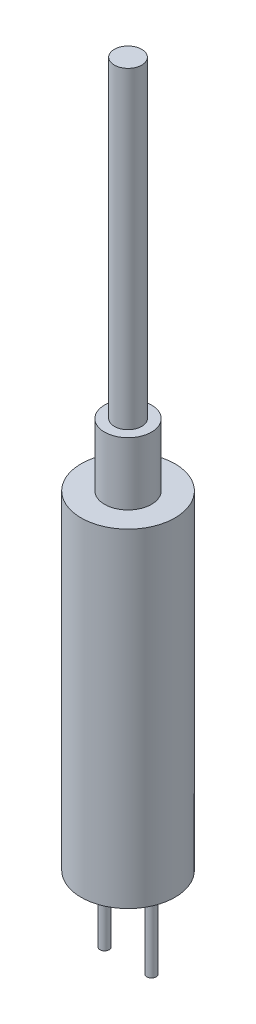
ISO-10303-21;
HEADER;
FILE_DESCRIPTION(('STEP AP214'),'2;1');
FILE_NAME('part.step','',(''),(''),'','','');
FILE_SCHEMA(('AUTOMOTIVE_DESIGN { 1 0 10303 214 1 1 1 1 }'));
ENDSEC;
DATA;
#1=APPLICATION_CONTEXT('core data for automotive mechanical design processes');
#2=APPLICATION_PROTOCOL_DEFINITION('international standard','automotive_design',2000,#1);
#3=PRODUCT_CONTEXT('',#1,'mechanical');
#4=PRODUCT('Part','Part','',(#3));
#5=PRODUCT_RELATED_PRODUCT_CATEGORY('part','',(#4));
#6=PRODUCT_DEFINITION_FORMATION('','',#4);
#7=PRODUCT_DEFINITION_CONTEXT('part definition',#1,'design');
#8=PRODUCT_DEFINITION('design','',#6,#7);
#9=PRODUCT_DEFINITION_SHAPE('','',#8);
#10=(LENGTH_UNIT() NAMED_UNIT(*) SI_UNIT(.MILLI.,.METRE.));
#11=(NAMED_UNIT(*) PLANE_ANGLE_UNIT() SI_UNIT($,.RADIAN.));
#12=(NAMED_UNIT(*) SI_UNIT($,.STERADIAN.) SOLID_ANGLE_UNIT());
#13=UNCERTAINTY_MEASURE_WITH_UNIT(LENGTH_MEASURE(1.E-05),#10,'distance_accuracy_value','');
#14=(GEOMETRIC_REPRESENTATION_CONTEXT(3) GLOBAL_UNCERTAINTY_ASSIGNED_CONTEXT((#13)) GLOBAL_UNIT_ASSIGNED_CONTEXT((#10,
#11,#12)) REPRESENTATION_CONTEXT('',''));
#15=CARTESIAN_POINT('',(0.,0.,0.));
#16=DIRECTION('',(0.,0.,1.));
#17=DIRECTION('',(1.,0.,0.));
#18=AXIS2_PLACEMENT_3D('',#15,#16,#17);
#19=CARTESIAN_POINT('',(0.,100.,0.));
#20=DIRECTION('',(0.,-1.,0.));
#21=DIRECTION('',(0.,0.,-1.));
#22=AXIS2_PLACEMENT_3D('',#19,#20,#21);
#23=CYLINDRICAL_SURFACE('',#22,1.75);
#24=CARTESIAN_POINT('',(0.,100.,0.));
#25=DIRECTION('',(0.,1.,0.));
#26=DIRECTION('',(0.,0.,1.));
#27=AXIS2_PLACEMENT_3D('',#24,#25,#26);
#28=CIRCLE('',#27,1.75);
#29=CARTESIAN_POINT('',(0.,100.,1.75));
#30=VERTEX_POINT('',#29);
#31=EDGE_CURVE('E11',#30,#30,#28,.T.);
#32=ORIENTED_EDGE('',*,*,#31,.F.);
#33=EDGE_LOOP('',(#32));
#34=FACE_BOUND('',#33,.T.);
#35=CARTESIAN_POINT('',(0.,60.,0.));
#36=DIRECTION('',(0.,1.,0.));
#37=DIRECTION('',(0.,0.,1.));
#38=AXIS2_PLACEMENT_3D('',#35,#36,#37);
#39=CIRCLE('',#38,1.75);
#40=CARTESIAN_POINT('',(0.,60.,1.75));
#41=VERTEX_POINT('',#40);
#42=EDGE_CURVE('E60',#41,#41,#39,.T.);
#43=ORIENTED_EDGE('',*,*,#42,.T.);
#44=EDGE_LOOP('',(#43));
#45=FACE_BOUND('',#44,.T.);
#46=ADVANCED_FACE('F53',(#34,#45),#23,.T.);
#47=CARTESIAN_POINT('',(0.,100.,0.));
#48=DIRECTION('',(0.,1.,0.));
#49=DIRECTION('',(0.,0.,1.));
#50=AXIS2_PLACEMENT_3D('',#47,#48,#49);
#51=PLANE('',#50);
#52=ORIENTED_EDGE('',*,*,#31,.T.);
#53=EDGE_LOOP('',(#52));
#54=FACE_BOUND('',#53,.T.);
#55=ADVANCED_FACE('F66',(#54),#51,.T.);
#56=CARTESIAN_POINT('',(0.,60.,0.));
#57=DIRECTION('',(0.,1.,0.));
#58=DIRECTION('',(0.,0.,1.));
#59=AXIS2_PLACEMENT_3D('',#56,#57,#58);
#60=PLANE('',#59);
#61=ORIENTED_EDGE('',*,*,#42,.F.);
#62=EDGE_LOOP('',(#61));
#63=FACE_BOUND('',#62,.T.);
#64=ADVANCED_FACE('F70',(#63),#60,.F.);
#65=CLOSED_SHELL('',(#46,#55,#64));
#66=MANIFOLD_SOLID_BREP('B2',#65);
#67=CARTESIAN_POINT('',(0.,60.,0.));
#68=DIRECTION('',(0.,-1.,0.));
#69=DIRECTION('',(0.,0.,-1.));
#70=AXIS2_PLACEMENT_3D('',#67,#68,#69);
#71=CYLINDRICAL_SURFACE('',#70,3.);
#72=CARTESIAN_POINT('',(0.,60.,0.));
#73=DIRECTION('',(0.,1.,0.));
#74=DIRECTION('',(0.,0.,1.));
#75=AXIS2_PLACEMENT_3D('',#72,#73,#74);
#76=CIRCLE('',#75,3.);
#77=CARTESIAN_POINT('',(0.,60.,3.));
#78=VERTEX_POINT('',#77);
#79=EDGE_CURVE('E52',#78,#78,#76,.T.);
#80=ORIENTED_EDGE('',*,*,#79,.F.);
#81=EDGE_LOOP('',(#80));
#82=FACE_BOUND('',#81,.T.);
#83=CARTESIAN_POINT('',(0.,52.,0.));
#84=DIRECTION('',(0.,1.,0.));
#85=DIRECTION('',(0.,0.,1.));
#86=AXIS2_PLACEMENT_3D('',#83,#84,#85);
#87=CIRCLE('',#86,3.);
#88=CARTESIAN_POINT('',(0.,52.,3.));
#89=VERTEX_POINT('',#88);
#90=EDGE_CURVE('E120',#89,#89,#87,.T.);
#91=ORIENTED_EDGE('',*,*,#90,.T.);
#92=EDGE_LOOP('',(#91));
#93=FACE_BOUND('',#92,.T.);
#94=ADVANCED_FACE('F113',(#82,#93),#71,.T.);
#95=CARTESIAN_POINT('',(0.,60.,0.));
#96=DIRECTION('',(0.,1.,0.));
#97=DIRECTION('',(0.,0.,1.));
#98=AXIS2_PLACEMENT_3D('',#95,#96,#97);
#99=PLANE('',#98);
#100=ORIENTED_EDGE('',*,*,#79,.T.);
#101=EDGE_LOOP('',(#100));
#102=FACE_BOUND('',#101,.T.);
#103=ADVANCED_FACE('F128',(#102),#99,.T.);
#104=CARTESIAN_POINT('',(0.,52.,0.));
#105=DIRECTION('',(0.,1.,0.));
#106=DIRECTION('',(0.,0.,1.));
#107=AXIS2_PLACEMENT_3D('',#104,#105,#106);
#108=PLANE('',#107);
#109=ORIENTED_EDGE('',*,*,#90,.F.);
#110=EDGE_LOOP('',(#109));
#111=FACE_BOUND('',#110,.T.);
#112=ADVANCED_FACE('F126',(#111),#108,.F.);
#113=CLOSED_SHELL('',(#94,#103,#112));
#114=MANIFOLD_SOLID_BREP('B6',#113);
#115=CARTESIAN_POINT('',(0.,52.,0.));
#116=DIRECTION('',(0.,-1.,0.));
#117=DIRECTION('',(0.,0.,-1.));
#118=AXIS2_PLACEMENT_3D('',#115,#116,#117);
#119=CYLINDRICAL_SURFACE('',#118,6.);
#120=CARTESIAN_POINT('',(0.,52.,0.));
#121=DIRECTION('',(0.,1.,0.));
#122=DIRECTION('',(0.,0.,1.));
#123=AXIS2_PLACEMENT_3D('',#120,#121,#122);
#124=CIRCLE('',#123,6.);
#125=CARTESIAN_POINT('',(0.,52.,-6.));
#126=VERTEX_POINT('',#125);
#127=EDGE_CURVE('E111',#126,#126,#124,.T.);
#128=CARTESIAN_POINT('',(0.,10.,0.));
#129=DIRECTION('',(0.,1.,0.));
#130=DIRECTION('',(0.,0.,1.));
#131=AXIS2_PLACEMENT_3D('',#128,#129,#130);
#132=CIRCLE('',#131,6.);
#133=CARTESIAN_POINT('',(0.,10.,-6.));
#134=VERTEX_POINT('',#133);
#135=EDGE_CURVE('E176',#134,#134,#132,.T.);
#136=CARTESIAN_POINT('',(0.,52.,-6.));
#137=CARTESIAN_POINT('',(0.,51.5625,-6.));
#138=CARTESIAN_POINT('',(0.,51.125,-6.));
#139=CARTESIAN_POINT('',(0.,50.25,-6.));
#140=CARTESIAN_POINT('',(0.,49.8125,-6.));
#141=CARTESIAN_POINT('',(0.,48.9375,-6.));
#142=CARTESIAN_POINT('',(0.,48.5,-6.));
#143=CARTESIAN_POINT('',(0.,47.625,-6.));
#144=CARTESIAN_POINT('',(0.,47.1875,-6.));
#145=CARTESIAN_POINT('',(0.,46.3125,-6.));
#146=CARTESIAN_POINT('',(0.,45.875,-6.));
#147=CARTESIAN_POINT('',(0.,45.,-6.));
#148=CARTESIAN_POINT('',(0.,44.5625,-6.));
#149=CARTESIAN_POINT('',(0.,43.6875,-6.));
#150=CARTESIAN_POINT('',(0.,43.25,-6.));
#151=CARTESIAN_POINT('',(0.,42.375,-6.));
#152=CARTESIAN_POINT('',(0.,41.9375,-6.));
#153=CARTESIAN_POINT('',(0.,41.0625,-6.));
#154=CARTESIAN_POINT('',(0.,40.625,-6.));
#155=CARTESIAN_POINT('',(0.,39.75,-6.));
#156=CARTESIAN_POINT('',(0.,39.3125,-6.));
#157=CARTESIAN_POINT('',(0.,38.4375,-6.));
#158=CARTESIAN_POINT('',(0.,38.,-6.));
#159=CARTESIAN_POINT('',(0.,37.125,-6.));
#160=CARTESIAN_POINT('',(0.,36.6875,-6.));
#161=CARTESIAN_POINT('',(0.,35.8125,-6.));
#162=CARTESIAN_POINT('',(0.,35.375,-6.));
#163=CARTESIAN_POINT('',(0.,34.5,-6.));
#164=CARTESIAN_POINT('',(0.,34.0625,-6.));
#165=CARTESIAN_POINT('',(0.,33.1875,-6.));
#166=CARTESIAN_POINT('',(0.,32.75,-6.));
#167=CARTESIAN_POINT('',(0.,31.875,-6.));
#168=CARTESIAN_POINT('',(0.,31.4375,-6.));
#169=CARTESIAN_POINT('',(0.,30.5625,-6.));
#170=CARTESIAN_POINT('',(0.,30.125,-6.));
#171=CARTESIAN_POINT('',(0.,29.25,-6.));
#172=CARTESIAN_POINT('',(0.,28.8125,-6.));
#173=CARTESIAN_POINT('',(0.,27.9375,-6.));
#174=CARTESIAN_POINT('',(0.,27.5,-6.));
#175=CARTESIAN_POINT('',(0.,26.625,-6.));
#176=CARTESIAN_POINT('',(0.,26.1875,-6.));
#177=CARTESIAN_POINT('',(0.,25.3125,-6.));
#178=CARTESIAN_POINT('',(0.,24.875,-6.));
#179=CARTESIAN_POINT('',(0.,24.,-6.));
#180=CARTESIAN_POINT('',(0.,23.5625,-6.));
#181=CARTESIAN_POINT('',(0.,22.6875,-6.));
#182=CARTESIAN_POINT('',(0.,22.25,-6.));
#183=CARTESIAN_POINT('',(0.,21.375,-6.));
#184=CARTESIAN_POINT('',(0.,20.9375,-6.));
#185=CARTESIAN_POINT('',(0.,20.0625,-6.));
#186=CARTESIAN_POINT('',(0.,19.625,-6.));
#187=CARTESIAN_POINT('',(0.,18.75,-6.));
#188=CARTESIAN_POINT('',(0.,18.3125,-6.));
#189=CARTESIAN_POINT('',(0.,17.4375,-6.));
#190=CARTESIAN_POINT('',(0.,17.,-6.));
#191=CARTESIAN_POINT('',(0.,16.125,-6.));
#192=CARTESIAN_POINT('',(0.,15.6875,-6.));
#193=CARTESIAN_POINT('',(0.,14.8125,-6.));
#194=CARTESIAN_POINT('',(0.,14.375,-6.));
#195=CARTESIAN_POINT('',(0.,13.5,-6.));
#196=CARTESIAN_POINT('',(0.,13.0625,-6.));
#197=CARTESIAN_POINT('',(0.,12.1875,-6.));
#198=CARTESIAN_POINT('',(0.,11.75,-6.));
#199=CARTESIAN_POINT('',(0.,10.875,-6.));
#200=CARTESIAN_POINT('',(0.,10.4375,-6.));
#201=CARTESIAN_POINT('',(0.,10.,-6.));
#202=B_SPLINE_CURVE_WITH_KNOTS('',3,(#136,#137,#138,#139,#140,#141,#142,#143,#144,#145,#146,
#147,#148,#149,#150,#151,#152,#153,#154,#155,#156,#157,#158,#159,#160,#161,#162,#163,#164,#165,
#166,#167,#168,#169,#170,#171,#172,#173,#174,#175,#176,#177,#178,#179,#180,#181,#182,#183,#184,
#185,#186,#187,#188,#189,#190,#191,#192,#193,#194,#195,#196,#197,#198,#199,#200,#201),
.UNSPECIFIED.,.F.,.F.,(4,2,2,2,2,2,2,2,2,2,2,2,2,2,2,2,2,2,2,2,2,2,2,2,2,2,2,2,2,2,2,2,4),(0.,
1.31249999999999,2.625,3.9375,5.25,6.5625,7.87499999999999,9.18749999999999,10.5,11.8125,13.125,
14.4375,15.75,17.0625,18.375,19.6875,21.,22.3125,23.625,24.9375,26.25,27.5625,28.875,30.1875,
31.5,32.8125,34.125,35.4375,36.75,38.0625,39.375,40.6875,42.),.UNSPECIFIED.);
#203=EDGE_CURVE('BSEAM177',#126,#134,#202,.T.);
#204=ORIENTED_EDGE('',*,*,#127,.F.);
#205=ORIENTED_EDGE('',*,*,#135,.T.);
#206=ORIENTED_EDGE('',*,*,#203,.T.);
#207=ORIENTED_EDGE('',*,*,#203,.F.);
#208=EDGE_LOOP('',(#204,#206,#205,#207));
#209=FACE_BOUND('',#208,.T.);
#210=ADVANCED_FACE('F177',(#209),#119,.T.);
#211=CARTESIAN_POINT('',(0.,52.,0.));
#212=DIRECTION('',(0.,1.,0.));
#213=DIRECTION('',(0.,0.,1.));
#214=AXIS2_PLACEMENT_3D('',#211,#212,#213);
#215=PLANE('',#214);
#216=ORIENTED_EDGE('',*,*,#127,.T.);
#217=EDGE_LOOP('',(#216));
#218=FACE_BOUND('',#217,.T.);
#219=ADVANCED_FACE('F192',(#218),#215,.T.);
#220=CARTESIAN_POINT('',(0.,10.,0.));
#221=DIRECTION('',(0.,1.,0.));
#222=DIRECTION('',(0.,0.,1.));
#223=AXIS2_PLACEMENT_3D('',#220,#221,#222);
#224=PLANE('',#223);
#225=ORIENTED_EDGE('',*,*,#135,.F.);
#226=EDGE_LOOP('',(#225));
#227=FACE_BOUND('',#226,.T.);
#228=ADVANCED_FACE('F188',(#227),#224,.F.);
#229=CLOSED_SHELL('',(#210,#219,#228));
#230=MANIFOLD_SOLID_BREP('B48',#229);
#231=CARTESIAN_POINT('',(3.,10.,0.));
#232=DIRECTION('',(0.,-1.,0.));
#233=DIRECTION('',(0.,0.,-1.));
#234=AXIS2_PLACEMENT_3D('',#231,#232,#233);
#235=CYLINDRICAL_SURFACE('',#234,0.6);
#236=CARTESIAN_POINT('',(3.,10.,0.));
#237=DIRECTION('',(0.,1.,0.));
#238=DIRECTION('',(0.,0.,1.));
#239=AXIS2_PLACEMENT_3D('',#236,#237,#238);
#240=CIRCLE('',#239,0.6);
#241=CARTESIAN_POINT('',(3.,10.,0.6));
#242=VERTEX_POINT('',#241);
#243=EDGE_CURVE('E238',#242,#242,#240,.T.);
#244=ORIENTED_EDGE('',*,*,#243,.F.);
#245=EDGE_LOOP('',(#244));
#246=FACE_BOUND('',#245,.T.);
#247=CARTESIAN_POINT('',(3.,0.,0.));
#248=DIRECTION('',(0.,1.,0.));
#249=DIRECTION('',(0.,0.,1.));
#250=AXIS2_PLACEMENT_3D('',#247,#248,#249);
#251=CIRCLE('',#250,0.6);
#252=CARTESIAN_POINT('',(3.,0.,0.6));
#253=VERTEX_POINT('',#252);
#254=EDGE_CURVE('E172',#253,#253,#251,.T.);
#255=ORIENTED_EDGE('',*,*,#254,.T.);
#256=EDGE_LOOP('',(#255));
#257=FACE_BOUND('',#256,.T.);
#258=ADVANCED_FACE('F237',(#246,#257),#235,.T.);
#259=CARTESIAN_POINT('',(3.,10.,0.));
#260=DIRECTION('',(0.,1.,0.));
#261=DIRECTION('',(0.,0.,1.));
#262=AXIS2_PLACEMENT_3D('',#259,#260,#261);
#263=PLANE('',#262);
#264=ORIENTED_EDGE('',*,*,#243,.T.);
#265=EDGE_LOOP('',(#264));
#266=FACE_BOUND('',#265,.T.);
#267=ADVANCED_FACE('F236',(#266),#263,.T.);
#268=CARTESIAN_POINT('',(3.,0.,0.));
#269=DIRECTION('',(0.,1.,0.));
#270=DIRECTION('',(0.,0.,1.));
#271=AXIS2_PLACEMENT_3D('',#268,#269,#270);
#272=PLANE('',#271);
#273=ORIENTED_EDGE('',*,*,#254,.F.);
#274=EDGE_LOOP('',(#273));
#275=FACE_BOUND('',#274,.T.);
#276=ADVANCED_FACE('F254',(#275),#272,.F.);
#277=CLOSED_SHELL('',(#258,#267,#276));
#278=MANIFOLD_SOLID_BREP('B108',#277);
#279=CARTESIAN_POINT('',(-3.,10.,0.));
#280=DIRECTION('',(0.,-1.,0.));
#281=DIRECTION('',(0.,0.,-1.));
#282=AXIS2_PLACEMENT_3D('',#279,#280,#281);
#283=CYLINDRICAL_SURFACE('',#282,0.6);
#284=CARTESIAN_POINT('',(-3.,10.,0.));
#285=DIRECTION('',(0.,1.,0.));
#286=DIRECTION('',(0.,0.,1.));
#287=AXIS2_PLACEMENT_3D('',#284,#285,#286);
#288=CIRCLE('',#287,0.6);
#289=CARTESIAN_POINT('',(-3.,10.,0.6));
#290=VERTEX_POINT('',#289);
#291=EDGE_CURVE('E233',#290,#290,#288,.T.);
#292=ORIENTED_EDGE('',*,*,#291,.F.);
#293=EDGE_LOOP('',(#292));
#294=FACE_BOUND('',#293,.T.);
#295=CARTESIAN_POINT('',(-3.,0.,0.));
#296=DIRECTION('',(0.,1.,0.));
#297=DIRECTION('',(0.,0.,1.));
#298=AXIS2_PLACEMENT_3D('',#295,#296,#297);
#299=CIRCLE('',#298,0.6);
#300=CARTESIAN_POINT('',(-3.,0.,0.6));
#301=VERTEX_POINT('',#300);
#302=EDGE_CURVE('E295',#301,#301,#299,.T.);
#303=ORIENTED_EDGE('',*,*,#302,.T.);
#304=EDGE_LOOP('',(#303));
#305=FACE_BOUND('',#304,.T.);
#306=ADVANCED_FACE('F286',(#294,#305),#283,.T.);
#307=CARTESIAN_POINT('',(-3.,10.,0.));
#308=DIRECTION('',(0.,1.,0.));
#309=DIRECTION('',(0.,0.,1.));
#310=AXIS2_PLACEMENT_3D('',#307,#308,#309);
#311=PLANE('',#310);
#312=ORIENTED_EDGE('',*,*,#291,.T.);
#313=EDGE_LOOP('',(#312));
#314=FACE_BOUND('',#313,.T.);
#315=ADVANCED_FACE('F301',(#314),#311,.T.);
#316=CARTESIAN_POINT('',(-3.,0.,0.));
#317=DIRECTION('',(0.,1.,0.));
#318=DIRECTION('',(0.,0.,1.));
#319=AXIS2_PLACEMENT_3D('',#316,#317,#318);
#320=PLANE('',#319);
#321=ORIENTED_EDGE('',*,*,#302,.F.);
#322=EDGE_LOOP('',(#321));
#323=FACE_BOUND('',#322,.T.);
#324=ADVANCED_FACE('F305',(#323),#320,.F.);
#325=CLOSED_SHELL('',(#306,#315,#324));
#326=MANIFOLD_SOLID_BREP('B168',#325);
#327=ADVANCED_BREP_SHAPE_REPRESENTATION('',(#18,#66,#114,#230,#278,#326),#14);
#328=SHAPE_DEFINITION_REPRESENTATION(#9,#327);
ENDSEC;
END-ISO-10303-21;
